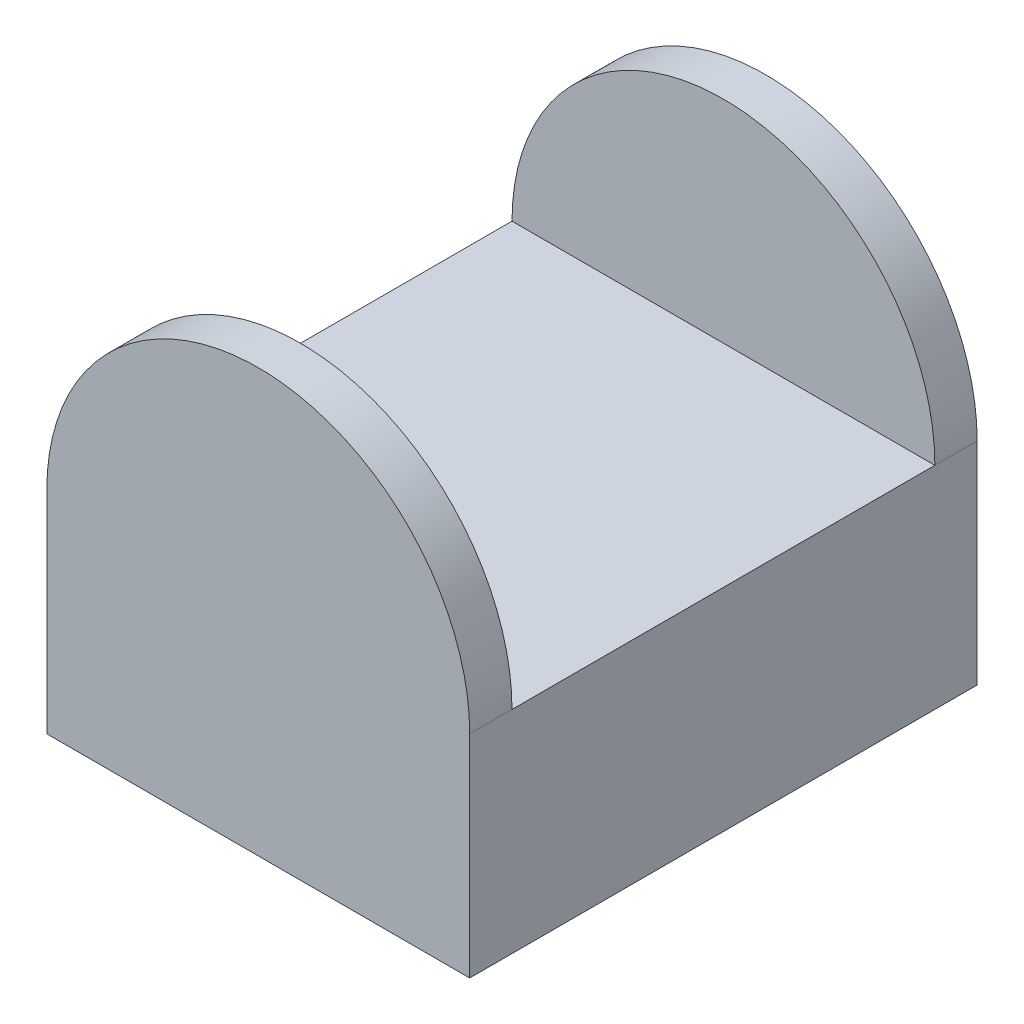
ISO-10303-21;
HEADER;
FILE_DESCRIPTION(('STEP AP214'),'2;1');
FILE_NAME('part.step','',(''),(''),'','','');
FILE_SCHEMA(('AUTOMOTIVE_DESIGN { 1 0 10303 214 1 1 1 1 }'));
ENDSEC;
DATA;
#1=APPLICATION_CONTEXT('core data for automotive mechanical design processes');
#2=APPLICATION_PROTOCOL_DEFINITION('international standard','automotive_design',2000,#1);
#3=PRODUCT_CONTEXT('',#1,'mechanical');
#4=PRODUCT('Part','Part','',(#3));
#5=PRODUCT_RELATED_PRODUCT_CATEGORY('part','',(#4));
#6=PRODUCT_DEFINITION_FORMATION('','',#4);
#7=PRODUCT_DEFINITION_CONTEXT('part definition',#1,'design');
#8=PRODUCT_DEFINITION('design','',#6,#7);
#9=PRODUCT_DEFINITION_SHAPE('','',#8);
#10=(LENGTH_UNIT() NAMED_UNIT(*) SI_UNIT(.MILLI.,.METRE.));
#11=(NAMED_UNIT(*) PLANE_ANGLE_UNIT() SI_UNIT($,.RADIAN.));
#12=(NAMED_UNIT(*) SI_UNIT($,.STERADIAN.) SOLID_ANGLE_UNIT());
#13=UNCERTAINTY_MEASURE_WITH_UNIT(LENGTH_MEASURE(1.E-05),#10,'distance_accuracy_value','');
#14=(GEOMETRIC_REPRESENTATION_CONTEXT(3) GLOBAL_UNCERTAINTY_ASSIGNED_CONTEXT((#13)) GLOBAL_UNIT_ASSIGNED_CONTEXT((#10,
#11,#12)) REPRESENTATION_CONTEXT('',''));
#15=CARTESIAN_POINT('',(0.,0.,0.));
#16=DIRECTION('',(0.,0.,1.));
#17=DIRECTION('',(1.,0.,0.));
#18=AXIS2_PLACEMENT_3D('',#15,#16,#17);
#19=CARTESIAN_POINT('',(0.,0.,30.48));
#20=DIRECTION('',(0.,0.,-1.));
#21=DIRECTION('',(-1.,0.,0.));
#22=AXIS2_PLACEMENT_3D('',#19,#20,#21);
#23=CYLINDRICAL_SURFACE('',#22,12.7);
#24=DIRECTION('',(0.,0.,-1.));
#25=VECTOR('',#24,1.);
#26=CARTESIAN_POINT('',(12.7,0.,30.48));
#27=LINE('',#26,#25);
#28=CARTESIAN_POINT('',(12.7,0.,30.48));
#29=VERTEX_POINT('',#28);
#30=CARTESIAN_POINT('',(12.7,0.,27.94));
#31=VERTEX_POINT('',#30);
#32=EDGE_CURVE('E120',#29,#31,#27,.T.);
#33=ORIENTED_EDGE('',*,*,#32,.T.);
#34=CARTESIAN_POINT('',(0.,0.,27.94));
#35=DIRECTION('',(0.,0.,1.));
#36=DIRECTION('',(1.,0.,0.));
#37=AXIS2_PLACEMENT_3D('',#34,#35,#36);
#38=CIRCLE('',#37,12.7);
#39=CARTESIAN_POINT('',(-12.7,0.,27.94));
#40=VERTEX_POINT('',#39);
#41=EDGE_CURVE('E11',#31,#40,#38,.T.);
#42=ORIENTED_EDGE('',*,*,#41,.T.);
#43=DIRECTION('',(0.,0.,-1.));
#44=VECTOR('',#43,1.);
#45=CARTESIAN_POINT('',(-12.7,0.,30.48));
#46=LINE('',#45,#44);
#47=CARTESIAN_POINT('',(-12.7,0.,30.48));
#48=VERTEX_POINT('',#47);
#49=EDGE_CURVE('E119',#48,#40,#46,.T.);
#50=ORIENTED_EDGE('',*,*,#49,.F.);
#51=CARTESIAN_POINT('',(0.,0.,30.48));
#52=DIRECTION('',(0.,0.,1.));
#53=DIRECTION('',(-1.,0.,0.));
#54=AXIS2_PLACEMENT_3D('',#51,#52,#53);
#55=CIRCLE('',#54,12.7);
#56=EDGE_CURVE('E170',#29,#48,#55,.T.);
#57=ORIENTED_EDGE('',*,*,#56,.F.);
#58=EDGE_LOOP('',(#33,#42,#50,#57));
#59=FACE_BOUND('',#58,.T.);
#60=ADVANCED_FACE('F39',(#59),#23,.T.);
#61=CARTESIAN_POINT('',(-12.7,-12.7,30.48));
#62=DIRECTION('',(0.,1.,0.));
#63=DIRECTION('',(-1.,0.,0.));
#64=AXIS2_PLACEMENT_3D('',#61,#62,#63);
#65=PLANE('',#64);
#66=DIRECTION('',(1.,0.,0.));
#67=VECTOR('',#66,1.);
#68=CARTESIAN_POINT('',(-12.7,-12.7,0.));
#69=LINE('',#68,#67);
#70=CARTESIAN_POINT('',(-12.7,-12.7,0.));
#71=VERTEX_POINT('',#70);
#72=CARTESIAN_POINT('',(12.7,-12.7,0.));
#73=VERTEX_POINT('',#72);
#74=EDGE_CURVE('E145',#71,#73,#69,.T.);
#75=ORIENTED_EDGE('',*,*,#74,.T.);
#76=DIRECTION('',(0.,0.,-1.));
#77=VECTOR('',#76,1.);
#78=CARTESIAN_POINT('',(12.7,-12.7,30.48));
#79=LINE('',#78,#77);
#80=CARTESIAN_POINT('',(12.7,-12.7,30.48));
#81=VERTEX_POINT('',#80);
#82=EDGE_CURVE('E134',#81,#73,#79,.T.);
#83=ORIENTED_EDGE('',*,*,#82,.F.);
#84=DIRECTION('',(1.,0.,0.));
#85=VECTOR('',#84,1.);
#86=CARTESIAN_POINT('',(-12.7,-12.7,30.48));
#87=LINE('',#86,#85);
#88=CARTESIAN_POINT('',(-12.7,-12.7,30.48));
#89=VERTEX_POINT('',#88);
#90=EDGE_CURVE('E164',#89,#81,#87,.T.);
#91=ORIENTED_EDGE('',*,*,#90,.F.);
#92=DIRECTION('',(0.,0.,-1.));
#93=VECTOR('',#92,1.);
#94=CARTESIAN_POINT('',(-12.7,-12.7,30.48));
#95=LINE('',#94,#93);
#96=EDGE_CURVE('E129',#89,#71,#95,.T.);
#97=ORIENTED_EDGE('',*,*,#96,.T.);
#98=EDGE_LOOP('',(#75,#83,#91,#97));
#99=FACE_BOUND('',#98,.T.);
#100=ADVANCED_FACE('F41',(#99),#65,.F.);
#101=CARTESIAN_POINT('',(12.7,-12.7,30.48));
#102=DIRECTION('',(-1.,0.,0.));
#103=DIRECTION('',(0.,-1.,0.));
#104=AXIS2_PLACEMENT_3D('',#101,#102,#103);
#105=PLANE('',#104);
#106=DIRECTION('',(0.,1.,0.));
#107=VECTOR('',#106,1.);
#108=CARTESIAN_POINT('',(12.7,-12.7,0.));
#109=LINE('',#108,#107);
#110=CARTESIAN_POINT('',(12.7,0.,0.));
#111=VERTEX_POINT('',#110);
#112=EDGE_CURVE('E151',#73,#111,#109,.T.);
#113=ORIENTED_EDGE('',*,*,#112,.T.);
#114=CARTESIAN_POINT('',(12.7,0.,2.54));
#115=VERTEX_POINT('',#114);
#116=EDGE_CURVE('E123',#115,#111,#27,.T.);
#117=ORIENTED_EDGE('',*,*,#116,.F.);
#118=DIRECTION('',(0.,0.,-1.));
#119=VECTOR('',#118,1.);
#120=CARTESIAN_POINT('',(12.7,0.,30.48));
#121=LINE('',#120,#119);
#122=EDGE_CURVE('E107',#115,#31,#121,.F.);
#123=ORIENTED_EDGE('',*,*,#122,.T.);
#124=ORIENTED_EDGE('',*,*,#32,.F.);
#125=DIRECTION('',(0.,1.,0.));
#126=VECTOR('',#125,1.);
#127=CARTESIAN_POINT('',(12.7,-12.7,30.48));
#128=LINE('',#127,#126);
#129=EDGE_CURVE('E92',#81,#29,#128,.T.);
#130=ORIENTED_EDGE('',*,*,#129,.F.);
#131=ORIENTED_EDGE('',*,*,#82,.T.);
#132=EDGE_LOOP('',(#113,#117,#123,#124,#130,#131));
#133=FACE_BOUND('',#132,.T.);
#134=ADVANCED_FACE('F150',(#133),#105,.F.);
#135=CARTESIAN_POINT('',(0.,0.,2.54));
#136=DIRECTION('',(0.,0.,-1.));
#137=DIRECTION('',(0.,1.,0.));
#138=AXIS2_PLACEMENT_3D('',#135,#136,#137);
#139=CIRCLE('',#138,12.7);
#140=CARTESIAN_POINT('',(-12.7,0.,2.54000000000001));
#141=VERTEX_POINT('',#140);
#142=EDGE_CURVE('E48',#141,#115,#139,.T.);
#143=ORIENTED_EDGE('',*,*,#142,.T.);
#144=ORIENTED_EDGE('',*,*,#116,.T.);
#145=CARTESIAN_POINT('',(0.,0.,0.));
#146=DIRECTION('',(0.,0.,1.));
#147=DIRECTION('',(-1.,0.,0.));
#148=AXIS2_PLACEMENT_3D('',#145,#146,#147);
#149=CIRCLE('',#148,12.7);
#150=CARTESIAN_POINT('',(-12.7,0.,0.));
#151=VERTEX_POINT('',#150);
#152=EDGE_CURVE('E158',#111,#151,#149,.T.);
#153=ORIENTED_EDGE('',*,*,#152,.T.);
#154=EDGE_CURVE('E124',#141,#151,#46,.T.);
#155=ORIENTED_EDGE('',*,*,#154,.F.);
#156=EDGE_LOOP('',(#143,#144,#153,#155));
#157=FACE_BOUND('',#156,.T.);
#158=ADVANCED_FACE('F139',(#157),#23,.T.);
#159=CARTESIAN_POINT('',(-12.7,0.,30.48));
#160=DIRECTION('',(1.,0.,0.));
#161=DIRECTION('',(0.,0.,-1.));
#162=AXIS2_PLACEMENT_3D('',#159,#160,#161);
#163=PLANE('',#162);
#164=DIRECTION('',(0.,-1.,0.));
#165=VECTOR('',#164,1.);
#166=CARTESIAN_POINT('',(-12.7,0.,0.));
#167=LINE('',#166,#165);
#168=EDGE_CURVE('E84',#151,#71,#167,.T.);
#169=ORIENTED_EDGE('',*,*,#168,.T.);
#170=ORIENTED_EDGE('',*,*,#96,.F.);
#171=DIRECTION('',(0.,-1.,0.));
#172=VECTOR('',#171,1.);
#173=CARTESIAN_POINT('',(-12.7,0.,30.48));
#174=LINE('',#173,#172);
#175=EDGE_CURVE('E64',#48,#89,#174,.T.);
#176=ORIENTED_EDGE('',*,*,#175,.F.);
#177=ORIENTED_EDGE('',*,*,#49,.T.);
#178=DIRECTION('',(0.,0.,-1.));
#179=VECTOR('',#178,1.);
#180=CARTESIAN_POINT('',(-12.7,0.,2.54));
#181=LINE('',#180,#179);
#182=EDGE_CURVE('E110',#40,#141,#181,.T.);
#183=ORIENTED_EDGE('',*,*,#182,.T.);
#184=ORIENTED_EDGE('',*,*,#154,.T.);
#185=EDGE_LOOP('',(#169,#170,#176,#177,#183,#184));
#186=FACE_BOUND('',#185,.T.);
#187=ADVANCED_FACE('F121',(#186),#163,.F.);
#188=CARTESIAN_POINT('',(0.,0.,30.48));
#189=DIRECTION('',(0.,0.,-1.));
#190=DIRECTION('',(-1.,0.,0.));
#191=AXIS2_PLACEMENT_3D('',#188,#189,#190);
#192=PLANE('',#191);
#193=ORIENTED_EDGE('',*,*,#90,.T.);
#194=ORIENTED_EDGE('',*,*,#129,.T.);
#195=ORIENTED_EDGE('',*,*,#56,.T.);
#196=ORIENTED_EDGE('',*,*,#175,.T.);
#197=EDGE_LOOP('',(#193,#194,#195,#196));
#198=FACE_BOUND('',#197,.T.);
#199=ADVANCED_FACE('F177',(#198),#192,.F.);
#200=CARTESIAN_POINT('',(0.,0.,0.));
#201=DIRECTION('',(0.,0.,-1.));
#202=DIRECTION('',(-1.,0.,0.));
#203=AXIS2_PLACEMENT_3D('',#200,#201,#202);
#204=PLANE('',#203);
#205=ORIENTED_EDGE('',*,*,#74,.F.);
#206=ORIENTED_EDGE('',*,*,#168,.F.);
#207=ORIENTED_EDGE('',*,*,#152,.F.);
#208=ORIENTED_EDGE('',*,*,#112,.F.);
#209=EDGE_LOOP('',(#205,#206,#207,#208));
#210=FACE_BOUND('',#209,.T.);
#211=ADVANCED_FACE('F160',(#210),#204,.T.);
#212=CARTESIAN_POINT('',(-12.7,0.,27.94));
#213=DIRECTION('',(0.,0.,1.));
#214=DIRECTION('',(1.,0.,0.));
#215=AXIS2_PLACEMENT_3D('',#212,#213,#214);
#216=PLANE('',#215);
#217=DIRECTION('',(1.,0.,0.));
#218=VECTOR('',#217,1.);
#219=CARTESIAN_POINT('',(-12.7,0.,27.94));
#220=LINE('',#219,#218);
#221=EDGE_CURVE('E103',#40,#31,#220,.T.);
#222=ORIENTED_EDGE('',*,*,#221,.F.);
#223=ORIENTED_EDGE('',*,*,#41,.F.);
#224=EDGE_LOOP('',(#222,#223));
#225=FACE_BOUND('',#224,.T.);
#226=ADVANCED_FACE('F104',(#225),#216,.F.);
#227=CARTESIAN_POINT('',(-12.7,12.7,2.54));
#228=DIRECTION('',(0.,0.,-1.));
#229=DIRECTION('',(0.,1.,0.));
#230=AXIS2_PLACEMENT_3D('',#227,#228,#229);
#231=PLANE('',#230);
#232=ORIENTED_EDGE('',*,*,#142,.F.);
#233=DIRECTION('',(1.,0.,0.));
#234=VECTOR('',#233,1.);
#235=CARTESIAN_POINT('',(-12.7,0.,2.54));
#236=LINE('',#235,#234);
#237=EDGE_CURVE('E55',#141,#115,#236,.T.);
#238=ORIENTED_EDGE('',*,*,#237,.T.);
#239=EDGE_LOOP('',(#232,#238));
#240=FACE_BOUND('',#239,.T.);
#241=ADVANCED_FACE('F147',(#240),#231,.F.);
#242=CARTESIAN_POINT('',(-12.7,0.,2.54));
#243=DIRECTION('',(0.,-1.,0.));
#244=DIRECTION('',(1.,0.,0.));
#245=AXIS2_PLACEMENT_3D('',#242,#243,#244);
#246=PLANE('',#245);
#247=ORIENTED_EDGE('',*,*,#237,.F.);
#248=ORIENTED_EDGE('',*,*,#182,.F.);
#249=ORIENTED_EDGE('',*,*,#221,.T.);
#250=ORIENTED_EDGE('',*,*,#122,.F.);
#251=EDGE_LOOP('',(#247,#248,#249,#250));
#252=FACE_BOUND('',#251,.T.);
#253=ADVANCED_FACE('F111',(#252),#246,.F.);
#254=CLOSED_SHELL('',(#60,#100,#134,#158,#187,#199,#211,#226,#241,#253));
#255=MANIFOLD_SOLID_BREP('B2',#254);
#256=ADVANCED_BREP_SHAPE_REPRESENTATION('',(#18,#255),#14);
#257=SHAPE_DEFINITION_REPRESENTATION(#9,#256);
ENDSEC;
END-ISO-10303-21;
